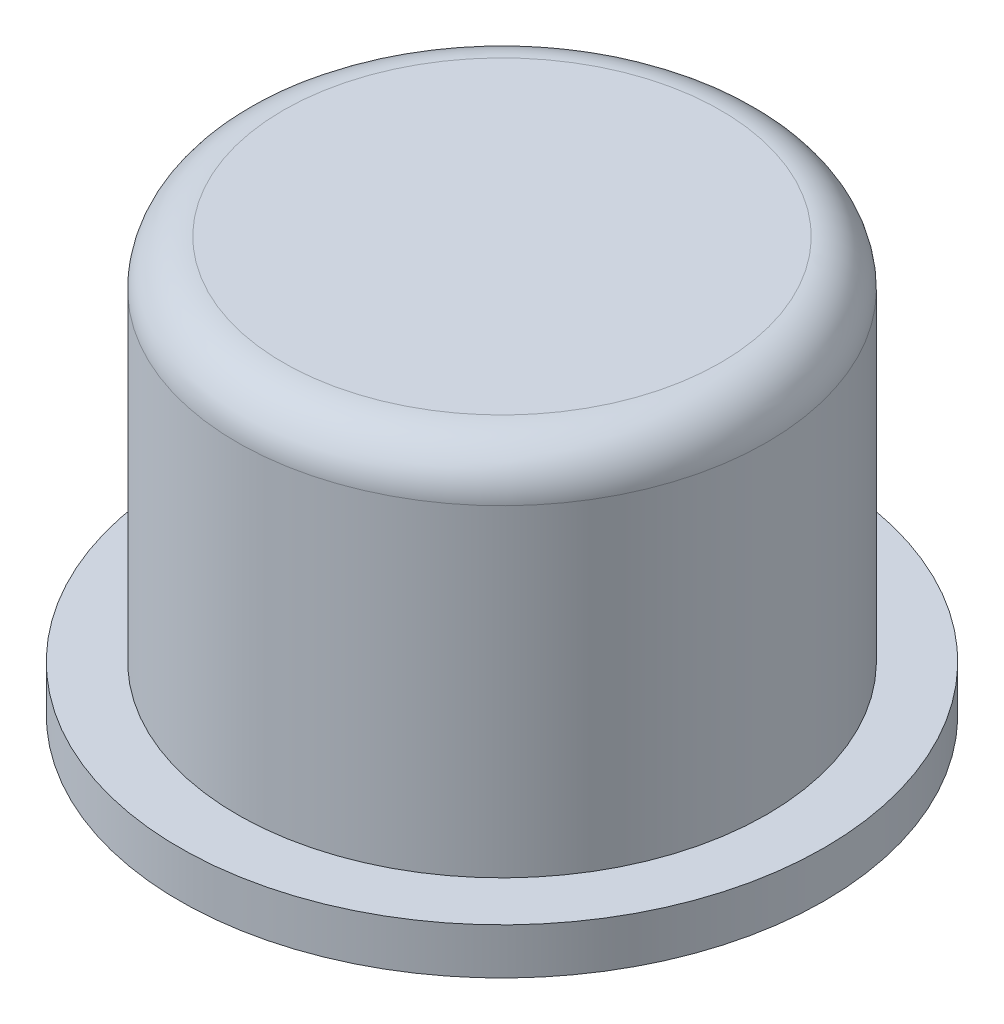
ISO-10303-21;
HEADER;
FILE_DESCRIPTION(('STEP AP214'),'2;1');
FILE_NAME('part.step','',(''),(''),'','','');
FILE_SCHEMA(('AUTOMOTIVE_DESIGN { 1 0 10303 214 1 1 1 1 }'));
ENDSEC;
DATA;
#1=APPLICATION_CONTEXT('core data for automotive mechanical design processes');
#2=APPLICATION_PROTOCOL_DEFINITION('international standard','automotive_design',2000,#1);
#3=PRODUCT_CONTEXT('',#1,'mechanical');
#4=PRODUCT('Part','Part','',(#3));
#5=PRODUCT_RELATED_PRODUCT_CATEGORY('part','',(#4));
#6=PRODUCT_DEFINITION_FORMATION('','',#4);
#7=PRODUCT_DEFINITION_CONTEXT('part definition',#1,'design');
#8=PRODUCT_DEFINITION('design','',#6,#7);
#9=PRODUCT_DEFINITION_SHAPE('','',#8);
#10=(LENGTH_UNIT() NAMED_UNIT(*) SI_UNIT(.MILLI.,.METRE.));
#11=(NAMED_UNIT(*) PLANE_ANGLE_UNIT() SI_UNIT($,.RADIAN.));
#12=(NAMED_UNIT(*) SI_UNIT($,.STERADIAN.) SOLID_ANGLE_UNIT());
#13=UNCERTAINTY_MEASURE_WITH_UNIT(LENGTH_MEASURE(1.E-05),#10,'distance_accuracy_value','');
#14=(GEOMETRIC_REPRESENTATION_CONTEXT(3) GLOBAL_UNCERTAINTY_ASSIGNED_CONTEXT((#13)) GLOBAL_UNIT_ASSIGNED_CONTEXT((#10,
#11,#12)) REPRESENTATION_CONTEXT('',''));
#15=CARTESIAN_POINT('',(0.,0.,0.));
#16=DIRECTION('',(0.,0.,1.));
#17=DIRECTION('',(1.,0.,0.));
#18=AXIS2_PLACEMENT_3D('',#15,#16,#17);
#19=CARTESIAN_POINT('',(0.,3.2,-3.85000282956601));
#20=DIRECTION('',(0.,-1.,0.));
#21=DIRECTION('',(1.,0.,0.));
#22=AXIS2_PLACEMENT_3D('',#19,#20,#21);
#23=TOROIDAL_SURFACE('',#22,1.9,0.4);
#24=CARTESIAN_POINT('',(0.,3.6,-3.85000282956601));
#25=DIRECTION('',(0.,-1.,0.));
#26=DIRECTION('',(1.,0.,0.));
#27=AXIS2_PLACEMENT_3D('',#24,#25,#26);
#28=CIRCLE('',#27,1.9);
#29=CARTESIAN_POINT('',(1.9,3.6,-3.85000282956601));
#30=VERTEX_POINT('',#29);
#31=EDGE_CURVE('E10',#30,#30,#28,.T.);
#32=ORIENTED_EDGE('',*,*,#31,.T.);
#33=EDGE_LOOP('',(#32));
#34=FACE_BOUND('',#33,.T.);
#35=CARTESIAN_POINT('',(0.,3.2,-3.85000282956601));
#36=DIRECTION('',(0.,-1.,0.));
#37=DIRECTION('',(1.,0.,0.));
#38=AXIS2_PLACEMENT_3D('',#35,#36,#37);
#39=CIRCLE('',#38,2.3);
#40=CARTESIAN_POINT('',(2.3,3.2,-3.85000282956601));
#41=VERTEX_POINT('',#40);
#42=EDGE_CURVE('E50',#41,#41,#39,.T.);
#43=ORIENTED_EDGE('',*,*,#42,.F.);
#44=EDGE_LOOP('',(#43));
#45=FACE_BOUND('',#44,.T.);
#46=ADVANCED_FACE('F31',(#34,#45),#23,.T.);
#47=CARTESIAN_POINT('',(1.9,3.6,-3.85000282956601));
#48=DIRECTION('',(0.,1.,0.));
#49=DIRECTION('',(-1.,0.,0.));
#50=AXIS2_PLACEMENT_3D('',#47,#48,#49);
#51=PLANE('',#50);
#52=ORIENTED_EDGE('',*,*,#31,.F.);
#53=EDGE_LOOP('',(#52));
#54=FACE_BOUND('',#53,.T.);
#55=ADVANCED_FACE('F72',(#54),#51,.T.);
#56=CARTESIAN_POINT('',(0.,0.,-3.85000282956601));
#57=DIRECTION('',(0.,-1.,0.));
#58=DIRECTION('',(1.,0.,0.));
#59=AXIS2_PLACEMENT_3D('',#56,#57,#58);
#60=PLANE('',#59);
#61=CARTESIAN_POINT('',(0.,0.,-3.85000282956601));
#62=DIRECTION('',(0.,-1.,0.));
#63=DIRECTION('',(1.,0.,0.));
#64=AXIS2_PLACEMENT_3D('',#61,#62,#63);
#65=CIRCLE('',#64,1.85);
#66=CARTESIAN_POINT('',(1.85,0.,-3.85000282956601));
#67=VERTEX_POINT('',#66);
#68=EDGE_CURVE('E54',#67,#67,#65,.T.);
#69=ORIENTED_EDGE('',*,*,#68,.F.);
#70=EDGE_LOOP('',(#69));
#71=FACE_BOUND('',#70,.T.);
#72=CARTESIAN_POINT('',(0.,0.,-3.85000282956601));
#73=DIRECTION('',(0.,-1.,0.));
#74=DIRECTION('',(1.,0.,0.));
#75=AXIS2_PLACEMENT_3D('',#72,#73,#74);
#76=CIRCLE('',#75,2.8);
#77=CARTESIAN_POINT('',(2.8,0.,-3.85000282956601));
#78=VERTEX_POINT('',#77);
#79=EDGE_CURVE('E37',#78,#78,#76,.T.);
#80=ORIENTED_EDGE('',*,*,#79,.T.);
#81=EDGE_LOOP('',(#80));
#82=FACE_BOUND('',#81,.T.);
#83=ADVANCED_FACE('F69',(#71,#82),#60,.T.);
#84=CARTESIAN_POINT('',(0.,3.6,-3.85000282956601));
#85=DIRECTION('',(0.,-1.,0.));
#86=DIRECTION('',(1.,0.,0.));
#87=AXIS2_PLACEMENT_3D('',#84,#85,#86);
#88=CYLINDRICAL_SURFACE('',#87,2.8);
#89=CARTESIAN_POINT('',(0.,0.4,-3.85000282956601));
#90=DIRECTION('',(0.,-1.,0.));
#91=DIRECTION('',(1.,0.,0.));
#92=AXIS2_PLACEMENT_3D('',#89,#90,#91);
#93=CIRCLE('',#92,2.8);
#94=CARTESIAN_POINT('',(2.8,0.4,-3.85000282956601));
#95=VERTEX_POINT('',#94);
#96=EDGE_CURVE('E41',#95,#95,#93,.T.);
#97=ORIENTED_EDGE('',*,*,#96,.T.);
#98=EDGE_LOOP('',(#97));
#99=FACE_BOUND('',#98,.T.);
#100=ORIENTED_EDGE('',*,*,#79,.F.);
#101=EDGE_LOOP('',(#100));
#102=FACE_BOUND('',#101,.T.);
#103=ADVANCED_FACE('F71',(#99,#102),#88,.T.);
#104=CARTESIAN_POINT('',(2.3,0.4,-3.85000282956601));
#105=DIRECTION('',(0.,1.,0.));
#106=DIRECTION('',(-1.,0.,0.));
#107=AXIS2_PLACEMENT_3D('',#104,#105,#106);
#108=PLANE('',#107);
#109=CARTESIAN_POINT('',(0.,0.4,-3.85000282956601));
#110=DIRECTION('',(0.,-1.,0.));
#111=DIRECTION('',(1.,0.,0.));
#112=AXIS2_PLACEMENT_3D('',#109,#110,#111);
#113=CIRCLE('',#112,2.3);
#114=CARTESIAN_POINT('',(2.3,0.4,-3.85000282956601));
#115=VERTEX_POINT('',#114);
#116=EDGE_CURVE('E45',#115,#115,#113,.T.);
#117=ORIENTED_EDGE('',*,*,#116,.T.);
#118=EDGE_LOOP('',(#117));
#119=FACE_BOUND('',#118,.T.);
#120=ORIENTED_EDGE('',*,*,#96,.F.);
#121=EDGE_LOOP('',(#120));
#122=FACE_BOUND('',#121,.T.);
#123=ADVANCED_FACE('F78',(#119,#122),#108,.T.);
#124=CARTESIAN_POINT('',(0.,3.6,-3.85000282956601));
#125=DIRECTION('',(0.,-1.,0.));
#126=DIRECTION('',(1.,0.,0.));
#127=AXIS2_PLACEMENT_3D('',#124,#125,#126);
#128=CYLINDRICAL_SURFACE('',#127,2.3);
#129=ORIENTED_EDGE('',*,*,#42,.T.);
#130=EDGE_LOOP('',(#129));
#131=FACE_BOUND('',#130,.T.);
#132=ORIENTED_EDGE('',*,*,#116,.F.);
#133=EDGE_LOOP('',(#132));
#134=FACE_BOUND('',#133,.T.);
#135=ADVANCED_FACE('F65',(#131,#134),#128,.T.);
#136=CARTESIAN_POINT('',(0.,2.8,-3.85000282956601));
#137=DIRECTION('',(0.,-1.,0.));
#138=DIRECTION('',(1.,0.,0.));
#139=AXIS2_PLACEMENT_3D('',#136,#137,#138);
#140=CYLINDRICAL_SURFACE('',#139,1.85);
#141=CARTESIAN_POINT('',(0.,2.8,-3.85000282956601));
#142=DIRECTION('',(0.,-1.,0.));
#143=DIRECTION('',(1.,0.,0.));
#144=AXIS2_PLACEMENT_3D('',#141,#142,#143);
#145=CIRCLE('',#144,1.85);
#146=CARTESIAN_POINT('',(1.85,2.8,-3.85000282956601));
#147=VERTEX_POINT('',#146);
#148=EDGE_CURVE('E53',#147,#147,#145,.T.);
#149=ORIENTED_EDGE('',*,*,#148,.F.);
#150=EDGE_LOOP('',(#149));
#151=FACE_BOUND('',#150,.T.);
#152=ORIENTED_EDGE('',*,*,#68,.T.);
#153=EDGE_LOOP('',(#152));
#154=FACE_BOUND('',#153,.T.);
#155=ADVANCED_FACE('F62',(#151,#154),#140,.F.);
#156=CARTESIAN_POINT('',(0.,2.8,-3.85000282956601));
#157=DIRECTION('',(0.,-1.,0.));
#158=DIRECTION('',(1.,0.,0.));
#159=AXIS2_PLACEMENT_3D('',#156,#157,#158);
#160=PLANE('',#159);
#161=ORIENTED_EDGE('',*,*,#148,.T.);
#162=EDGE_LOOP('',(#161));
#163=FACE_BOUND('',#162,.T.);
#164=ADVANCED_FACE('F60',(#163),#160,.T.);
#165=CLOSED_SHELL('',(#46,#55,#83,#103,#123,#135,#155,#164));
#166=MANIFOLD_SOLID_BREP('B2',#165);
#167=ADVANCED_BREP_SHAPE_REPRESENTATION('',(#18,#166),#14);
#168=SHAPE_DEFINITION_REPRESENTATION(#9,#167);
ENDSEC;
END-ISO-10303-21;
